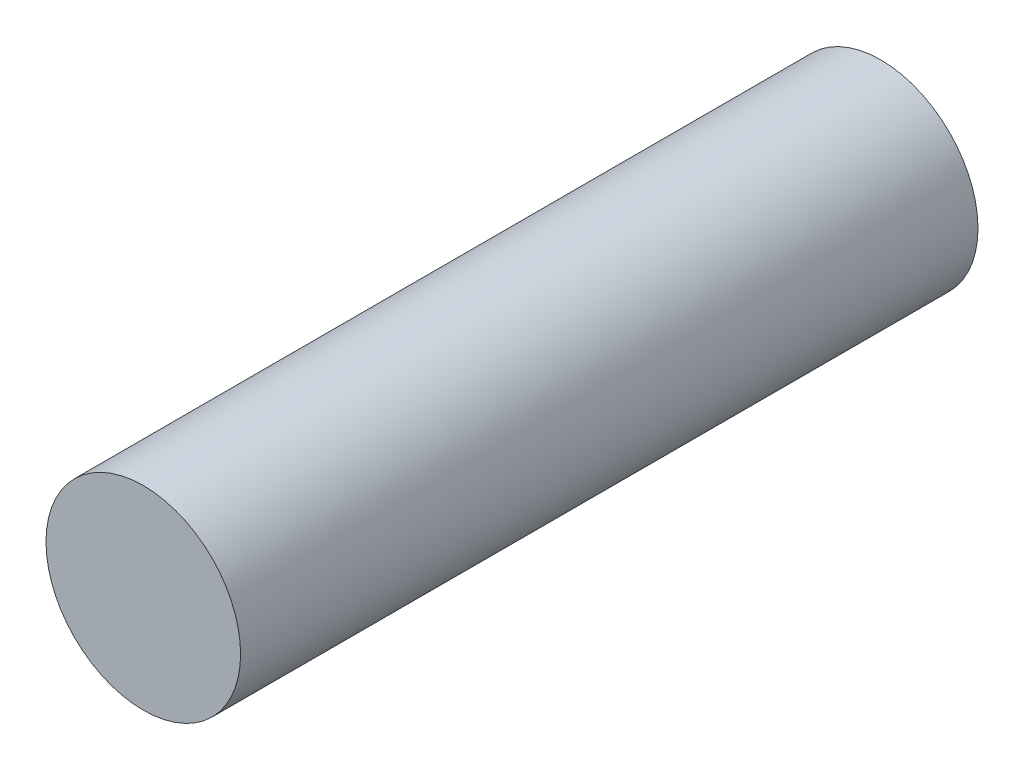
ISO-10303-21;
HEADER;
FILE_DESCRIPTION(('STEP AP214'),'2;1');
FILE_NAME('part.step','',(''),(''),'','','');
FILE_SCHEMA(('AUTOMOTIVE_DESIGN { 1 0 10303 214 1 1 1 1 }'));
ENDSEC;
DATA;
#1=APPLICATION_CONTEXT('core data for automotive mechanical design processes');
#2=APPLICATION_PROTOCOL_DEFINITION('international standard','automotive_design',2000,#1);
#3=PRODUCT_CONTEXT('',#1,'mechanical');
#4=PRODUCT('Part','Part','',(#3));
#5=PRODUCT_RELATED_PRODUCT_CATEGORY('part','',(#4));
#6=PRODUCT_DEFINITION_FORMATION('','',#4);
#7=PRODUCT_DEFINITION_CONTEXT('part definition',#1,'design');
#8=PRODUCT_DEFINITION('design','',#6,#7);
#9=PRODUCT_DEFINITION_SHAPE('','',#8);
#10=(LENGTH_UNIT() NAMED_UNIT(*) SI_UNIT(.MILLI.,.METRE.));
#11=(NAMED_UNIT(*) PLANE_ANGLE_UNIT() SI_UNIT($,.RADIAN.));
#12=(NAMED_UNIT(*) SI_UNIT($,.STERADIAN.) SOLID_ANGLE_UNIT());
#13=UNCERTAINTY_MEASURE_WITH_UNIT(LENGTH_MEASURE(1.E-05),#10,'distance_accuracy_value','');
#14=(GEOMETRIC_REPRESENTATION_CONTEXT(3) GLOBAL_UNCERTAINTY_ASSIGNED_CONTEXT((#13)) GLOBAL_UNIT_ASSIGNED_CONTEXT((#10,
#11,#12)) REPRESENTATION_CONTEXT('',''));
#15=CARTESIAN_POINT('',(0.,0.,0.));
#16=DIRECTION('',(0.,0.,1.));
#17=DIRECTION('',(1.,0.,0.));
#18=AXIS2_PLACEMENT_3D('',#15,#16,#17);
#19=CARTESIAN_POINT('',(0.,0.,228.6));
#20=DIRECTION('',(0.,0.,-1.));
#21=DIRECTION('',(-1.,0.,0.));
#22=AXIS2_PLACEMENT_3D('',#19,#20,#21);
#23=CYLINDRICAL_SURFACE('',#22,30.1625);
#24=CARTESIAN_POINT('',(0.,0.,228.6));
#25=DIRECTION('',(0.,0.,1.));
#26=DIRECTION('',(1.,0.,0.));
#27=AXIS2_PLACEMENT_3D('',#24,#25,#26);
#28=CIRCLE('',#27,30.1625);
#29=CARTESIAN_POINT('',(30.1625,0.,228.6));
#30=VERTEX_POINT('',#29);
#31=EDGE_CURVE('E10',#30,#30,#28,.T.);
#32=ORIENTED_EDGE('',*,*,#31,.F.);
#33=EDGE_LOOP('',(#32));
#34=FACE_BOUND('',#33,.T.);
#35=CARTESIAN_POINT('',(0.,0.,0.));
#36=DIRECTION('',(0.,0.,1.));
#37=DIRECTION('',(1.,0.,0.));
#38=AXIS2_PLACEMENT_3D('',#35,#36,#37);
#39=CIRCLE('',#38,30.1625);
#40=CARTESIAN_POINT('',(30.1625,0.,0.));
#41=VERTEX_POINT('',#40);
#42=EDGE_CURVE('E34',#41,#41,#39,.T.);
#43=ORIENTED_EDGE('',*,*,#42,.T.);
#44=EDGE_LOOP('',(#43));
#45=FACE_BOUND('',#44,.T.);
#46=ADVANCED_FACE('F31',(#34,#45),#23,.T.);
#47=CARTESIAN_POINT('',(0.,0.,228.6));
#48=DIRECTION('',(0.,0.,1.));
#49=DIRECTION('',(1.,0.,0.));
#50=AXIS2_PLACEMENT_3D('',#47,#48,#49);
#51=PLANE('',#50);
#52=ORIENTED_EDGE('',*,*,#31,.T.);
#53=EDGE_LOOP('',(#52));
#54=FACE_BOUND('',#53,.T.);
#55=ADVANCED_FACE('F46',(#54),#51,.T.);
#56=CARTESIAN_POINT('',(0.,0.,0.));
#57=DIRECTION('',(0.,0.,1.));
#58=DIRECTION('',(1.,0.,0.));
#59=AXIS2_PLACEMENT_3D('',#56,#57,#58);
#60=PLANE('',#59);
#61=ORIENTED_EDGE('',*,*,#42,.F.);
#62=EDGE_LOOP('',(#61));
#63=FACE_BOUND('',#62,.T.);
#64=ADVANCED_FACE('F44',(#63),#60,.F.);
#65=CLOSED_SHELL('',(#46,#55,#64));
#66=MANIFOLD_SOLID_BREP('B2',#65);
#67=ADVANCED_BREP_SHAPE_REPRESENTATION('',(#18,#66),#14);
#68=SHAPE_DEFINITION_REPRESENTATION(#9,#67);
ENDSEC;
END-ISO-10303-21;
